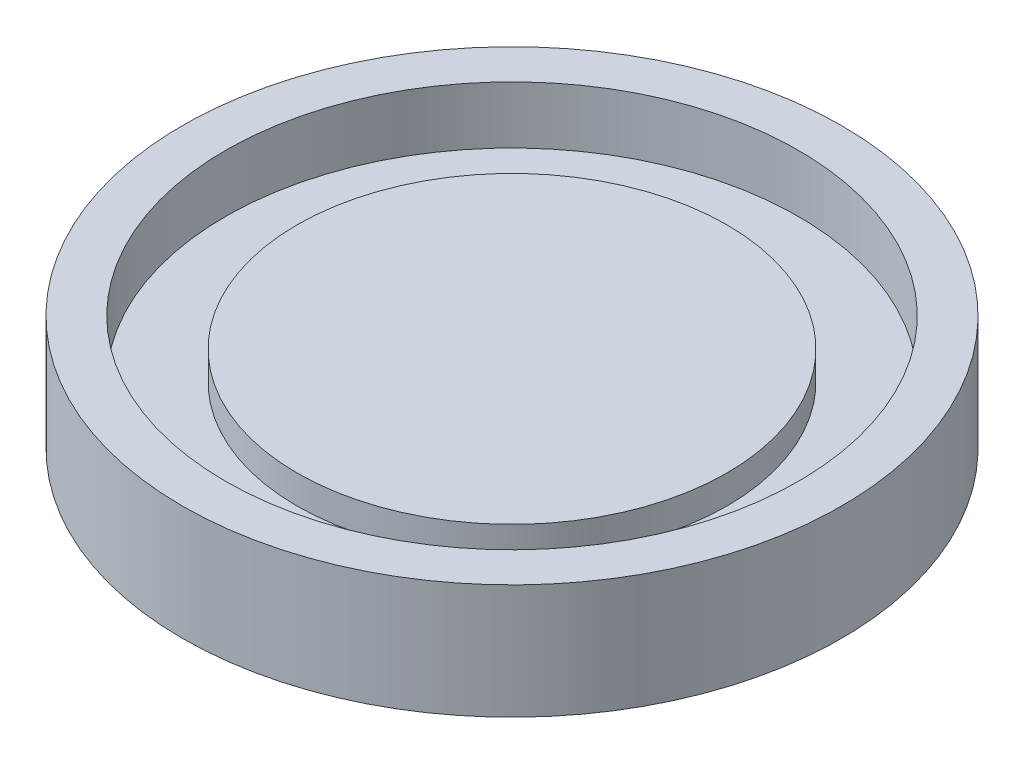
ISO-10303-21;
HEADER;
FILE_DESCRIPTION(('STEP AP214'),'2;1');
FILE_NAME('part.step','',(''),(''),'','','');
FILE_SCHEMA(('AUTOMOTIVE_DESIGN { 1 0 10303 214 1 1 1 1 }'));
ENDSEC;
DATA;
#1=APPLICATION_CONTEXT('core data for automotive mechanical design processes');
#2=APPLICATION_PROTOCOL_DEFINITION('international standard','automotive_design',2000,#1);
#3=PRODUCT_CONTEXT('',#1,'mechanical');
#4=PRODUCT('Part','Part','',(#3));
#5=PRODUCT_RELATED_PRODUCT_CATEGORY('part','',(#4));
#6=PRODUCT_DEFINITION_FORMATION('','',#4);
#7=PRODUCT_DEFINITION_CONTEXT('part definition',#1,'design');
#8=PRODUCT_DEFINITION('design','',#6,#7);
#9=PRODUCT_DEFINITION_SHAPE('','',#8);
#10=(LENGTH_UNIT() NAMED_UNIT(*) SI_UNIT(.MILLI.,.METRE.));
#11=(NAMED_UNIT(*) PLANE_ANGLE_UNIT() SI_UNIT($,.RADIAN.));
#12=(NAMED_UNIT(*) SI_UNIT($,.STERADIAN.) SOLID_ANGLE_UNIT());
#13=UNCERTAINTY_MEASURE_WITH_UNIT(LENGTH_MEASURE(1.E-05),#10,'distance_accuracy_value','');
#14=(GEOMETRIC_REPRESENTATION_CONTEXT(3) GLOBAL_UNCERTAINTY_ASSIGNED_CONTEXT((#13)) GLOBAL_UNIT_ASSIGNED_CONTEXT((#10,
#11,#12)) REPRESENTATION_CONTEXT('',''));
#15=CARTESIAN_POINT('',(0.,0.,0.));
#16=DIRECTION('',(0.,0.,1.));
#17=DIRECTION('',(1.,0.,0.));
#18=AXIS2_PLACEMENT_3D('',#15,#16,#17);
#19=CARTESIAN_POINT('',(0.,2.54,0.));
#20=DIRECTION('',(0.,-1.,0.));
#21=DIRECTION('',(0.,0.,-1.));
#22=AXIS2_PLACEMENT_3D('',#19,#20,#21);
#23=CYLINDRICAL_SURFACE('',#22,14.605);
#24=CARTESIAN_POINT('',(0.,0.,0.));
#25=DIRECTION('',(0.,1.,0.));
#26=DIRECTION('',(0.,0.,1.));
#27=AXIS2_PLACEMENT_3D('',#24,#25,#26);
#28=CIRCLE('',#27,14.605);
#29=CARTESIAN_POINT('',(0.,0.,14.605));
#30=VERTEX_POINT('',#29);
#31=EDGE_CURVE('E44',#30,#30,#28,.T.);
#32=ORIENTED_EDGE('',*,*,#31,.T.);
#33=EDGE_LOOP('',(#32));
#34=FACE_BOUND('',#33,.T.);
#35=CARTESIAN_POINT('',(0.,5.08,0.));
#36=DIRECTION('',(0.,1.,0.));
#37=DIRECTION('',(0.,0.,1.));
#38=AXIS2_PLACEMENT_3D('',#35,#36,#37);
#39=CIRCLE('',#38,14.605);
#40=CARTESIAN_POINT('',(0.,5.08,14.605));
#41=VERTEX_POINT('',#40);
#42=EDGE_CURVE('E49',#41,#41,#39,.T.);
#43=ORIENTED_EDGE('',*,*,#42,.F.);
#44=EDGE_LOOP('',(#43));
#45=FACE_BOUND('',#44,.T.);
#46=ADVANCED_FACE('F37',(#34,#45),#23,.T.);
#47=CARTESIAN_POINT('',(0.,0.,0.));
#48=DIRECTION('',(0.,1.,0.));
#49=DIRECTION('',(0.,0.,1.));
#50=AXIS2_PLACEMENT_3D('',#47,#48,#49);
#51=PLANE('',#50);
#52=ORIENTED_EDGE('',*,*,#31,.F.);
#53=EDGE_LOOP('',(#52));
#54=FACE_BOUND('',#53,.T.);
#55=ADVANCED_FACE('F90',(#54),#51,.F.);
#56=CARTESIAN_POINT('',(0.,5.08,0.));
#57=DIRECTION('',(0.,1.,0.));
#58=DIRECTION('',(0.,0.,1.));
#59=AXIS2_PLACEMENT_3D('',#56,#57,#58);
#60=PLANE('',#59);
#61=ORIENTED_EDGE('',*,*,#42,.T.);
#62=EDGE_LOOP('',(#61));
#63=FACE_BOUND('',#62,.T.);
#64=CARTESIAN_POINT('',(0.,5.08,0.));
#65=DIRECTION('',(0.,1.,0.));
#66=DIRECTION('',(0.,0.,1.));
#67=AXIS2_PLACEMENT_3D('',#64,#65,#66);
#68=CIRCLE('',#67,12.7);
#69=CARTESIAN_POINT('',(0.,5.08,12.7));
#70=VERTEX_POINT('',#69);
#71=EDGE_CURVE('E54',#70,#70,#68,.T.);
#72=ORIENTED_EDGE('',*,*,#71,.F.);
#73=EDGE_LOOP('',(#72));
#74=FACE_BOUND('',#73,.T.);
#75=ADVANCED_FACE('F85',(#63,#74),#60,.T.);
#76=CARTESIAN_POINT('',(0.,5.08,0.));
#77=DIRECTION('',(0.,-1.,0.));
#78=DIRECTION('',(0.,0.,-1.));
#79=AXIS2_PLACEMENT_3D('',#76,#77,#78);
#80=CYLINDRICAL_SURFACE('',#79,12.7);
#81=ORIENTED_EDGE('',*,*,#71,.T.);
#82=EDGE_LOOP('',(#81));
#83=FACE_BOUND('',#82,.T.);
#84=CARTESIAN_POINT('',(0.,2.54,0.));
#85=DIRECTION('',(0.,1.,0.));
#86=DIRECTION('',(0.,0.,1.));
#87=AXIS2_PLACEMENT_3D('',#84,#85,#86);
#88=CIRCLE('',#87,12.7);
#89=CARTESIAN_POINT('',(0.,2.54,12.7));
#90=VERTEX_POINT('',#89);
#91=EDGE_CURVE('E10',#90,#90,#88,.F.);
#92=ORIENTED_EDGE('',*,*,#91,.T.);
#93=EDGE_LOOP('',(#92));
#94=FACE_BOUND('',#93,.T.);
#95=ADVANCED_FACE('F80',(#83,#94),#80,.F.);
#96=CARTESIAN_POINT('',(0.,2.54,0.));
#97=DIRECTION('',(0.,1.,0.));
#98=DIRECTION('',(0.,0.,1.));
#99=AXIS2_PLACEMENT_3D('',#96,#97,#98);
#100=PLANE('',#99);
#101=CARTESIAN_POINT('',(0.,2.54,0.));
#102=DIRECTION('',(0.,1.,0.));
#103=DIRECTION('',(0.,0.,1.));
#104=AXIS2_PLACEMENT_3D('',#101,#102,#103);
#105=CIRCLE('',#104,9.525);
#106=CARTESIAN_POINT('',(0.,2.54,9.525));
#107=VERTEX_POINT('',#106);
#108=EDGE_CURVE('E61',#107,#107,#105,.T.);
#109=ORIENTED_EDGE('',*,*,#108,.F.);
#110=EDGE_LOOP('',(#109));
#111=FACE_BOUND('',#110,.T.);
#112=ORIENTED_EDGE('',*,*,#91,.F.);
#113=EDGE_LOOP('',(#112));
#114=FACE_BOUND('',#113,.T.);
#115=ADVANCED_FACE('F74',(#111,#114),#100,.T.);
#116=CARTESIAN_POINT('',(0.,3.81,0.));
#117=DIRECTION('',(0.,-1.,0.));
#118=DIRECTION('',(0.,0.,-1.));
#119=AXIS2_PLACEMENT_3D('',#116,#117,#118);
#120=CYLINDRICAL_SURFACE('',#119,9.525);
#121=CARTESIAN_POINT('',(0.,3.81,0.));
#122=DIRECTION('',(0.,1.,0.));
#123=DIRECTION('',(0.,0.,1.));
#124=AXIS2_PLACEMENT_3D('',#121,#122,#123);
#125=CIRCLE('',#124,9.525);
#126=CARTESIAN_POINT('',(0.,3.81,9.525));
#127=VERTEX_POINT('',#126);
#128=EDGE_CURVE('E60',#127,#127,#125,.T.);
#129=ORIENTED_EDGE('',*,*,#128,.F.);
#130=EDGE_LOOP('',(#129));
#131=FACE_BOUND('',#130,.T.);
#132=ORIENTED_EDGE('',*,*,#108,.T.);
#133=EDGE_LOOP('',(#132));
#134=FACE_BOUND('',#133,.T.);
#135=ADVANCED_FACE('F71',(#131,#134),#120,.T.);
#136=CARTESIAN_POINT('',(0.,3.81,0.));
#137=DIRECTION('',(0.,1.,0.));
#138=DIRECTION('',(0.,0.,1.));
#139=AXIS2_PLACEMENT_3D('',#136,#137,#138);
#140=PLANE('',#139);
#141=ORIENTED_EDGE('',*,*,#128,.T.);
#142=EDGE_LOOP('',(#141));
#143=FACE_BOUND('',#142,.T.);
#144=ADVANCED_FACE('F69',(#143),#140,.T.);
#145=CLOSED_SHELL('',(#46,#55,#75,#95,#115,#135,#144));
#146=MANIFOLD_SOLID_BREP('B2',#145);
#147=ADVANCED_BREP_SHAPE_REPRESENTATION('',(#18,#146),#14);
#148=SHAPE_DEFINITION_REPRESENTATION(#9,#147);
ENDSEC;
END-ISO-10303-21;
